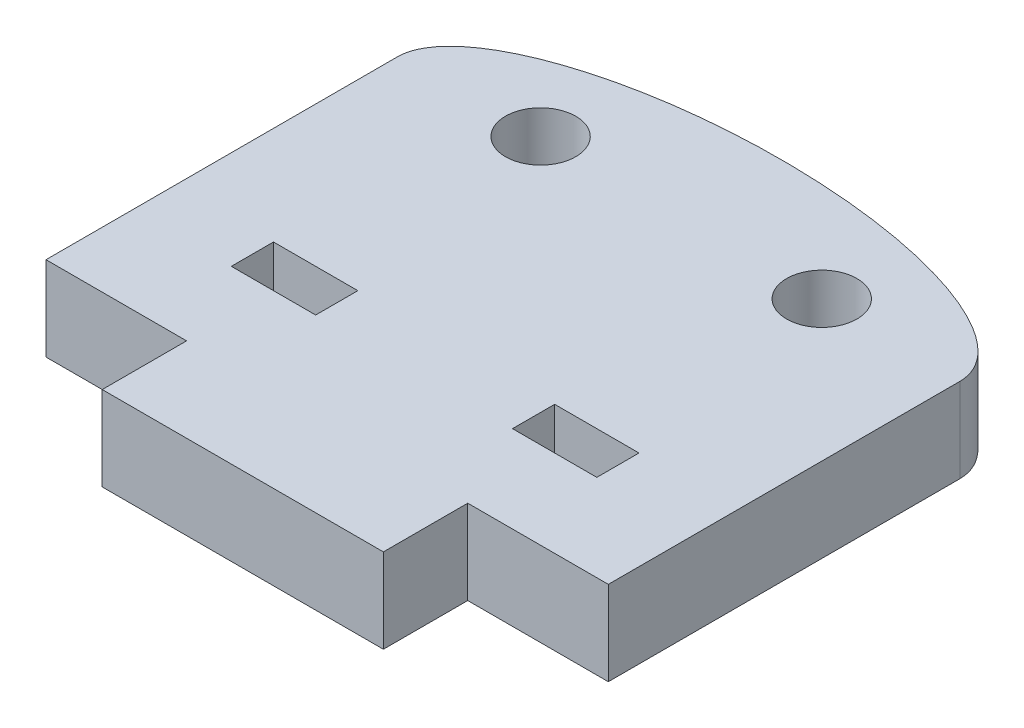
ISO-10303-21;
HEADER;
FILE_DESCRIPTION(('STEP AP214'),'2;1');
FILE_NAME('part.step','',(''),(''),'','','');
FILE_SCHEMA(('AUTOMOTIVE_DESIGN { 1 0 10303 214 1 1 1 1 }'));
ENDSEC;
DATA;
#1=APPLICATION_CONTEXT('core data for automotive mechanical design processes');
#2=APPLICATION_PROTOCOL_DEFINITION('international standard','automotive_design',2000,#1);
#3=PRODUCT_CONTEXT('',#1,'mechanical');
#4=PRODUCT('Part','Part','',(#3));
#5=PRODUCT_RELATED_PRODUCT_CATEGORY('part','',(#4));
#6=PRODUCT_DEFINITION_FORMATION('','',#4);
#7=PRODUCT_DEFINITION_CONTEXT('part definition',#1,'design');
#8=PRODUCT_DEFINITION('design','',#6,#7);
#9=PRODUCT_DEFINITION_SHAPE('','',#8);
#10=(LENGTH_UNIT() NAMED_UNIT(*) SI_UNIT(.MILLI.,.METRE.));
#11=(NAMED_UNIT(*) PLANE_ANGLE_UNIT() SI_UNIT($,.RADIAN.));
#12=(NAMED_UNIT(*) SI_UNIT($,.STERADIAN.) SOLID_ANGLE_UNIT());
#13=UNCERTAINTY_MEASURE_WITH_UNIT(LENGTH_MEASURE(1.E-05),#10,'distance_accuracy_value','');
#14=(GEOMETRIC_REPRESENTATION_CONTEXT(3) GLOBAL_UNCERTAINTY_ASSIGNED_CONTEXT((#13)) GLOBAL_UNIT_ASSIGNED_CONTEXT((#10,
#11,#12)) REPRESENTATION_CONTEXT('',''));
#15=CARTESIAN_POINT('',(0.,0.,0.));
#16=DIRECTION('',(0.,0.,1.));
#17=DIRECTION('',(1.,0.,0.));
#18=AXIS2_PLACEMENT_3D('',#15,#16,#17);
#19=CARTESIAN_POINT('',(-10.,6.,0.182836163524163));
#20=DIRECTION('',(0.,-1.,0.));
#21=DIRECTION('',(0.,0.,-1.));
#22=AXIS2_PLACEMENT_3D('',#19,#20,#21);
#23=PLANE('',#22);
#24=CARTESIAN_POINT('',(-20.,6.,0.));
#25=DIRECTION('',(0.,1.,0.));
#26=DIRECTION('',(0.,0.,1.));
#27=AXIS2_PLACEMENT_3D('',#24,#25,#26);
#28=CIRCLE('',#27,2.5);
#29=CARTESIAN_POINT('',(-20.,6.,2.5));
#30=VERTEX_POINT('',#29);
#31=EDGE_CURVE('E182',#30,#30,#28,.T.);
#32=ORIENTED_EDGE('',*,*,#31,.F.);
#33=EDGE_LOOP('',(#32));
#34=FACE_BOUND('',#33,.T.);
#35=DIRECTION('',(0.,0.,-1.));
#36=VECTOR('',#35,1.);
#37=CARTESIAN_POINT('',(3.00000000000001,6.,16.));
#38=LINE('',#37,#36);
#39=CARTESIAN_POINT('',(3.00000000000001,6.,19.));
#40=VERTEX_POINT('',#39);
#41=CARTESIAN_POINT('',(3.00000000000001,6.,16.));
#42=VERTEX_POINT('',#41);
#43=EDGE_CURVE('E188',#40,#42,#38,.T.);
#44=ORIENTED_EDGE('',*,*,#43,.F.);
#45=DIRECTION('',(1.,0.,0.));
#46=VECTOR('',#45,1.);
#47=CARTESIAN_POINT('',(-2.99999999999999,6.,19.));
#48=LINE('',#47,#46);
#49=CARTESIAN_POINT('',(-2.99999999999999,6.,19.));
#50=VERTEX_POINT('',#49);
#51=EDGE_CURVE('E196',#50,#40,#48,.T.);
#52=ORIENTED_EDGE('',*,*,#51,.F.);
#53=DIRECTION('',(0.,0.,1.));
#54=VECTOR('',#53,1.);
#55=CARTESIAN_POINT('',(-2.99999999999999,6.,16.));
#56=LINE('',#55,#54);
#57=CARTESIAN_POINT('',(-2.99999999999999,6.,16.));
#58=VERTEX_POINT('',#57);
#59=EDGE_CURVE('E193',#58,#50,#56,.T.);
#60=ORIENTED_EDGE('',*,*,#59,.F.);
#61=DIRECTION('',(-1.,0.,0.));
#62=VECTOR('',#61,1.);
#63=CARTESIAN_POINT('',(-2.99999999999999,6.,16.));
#64=LINE('',#63,#62);
#65=EDGE_CURVE('E190',#42,#58,#64,.T.);
#66=ORIENTED_EDGE('',*,*,#65,.F.);
#67=EDGE_LOOP('',(#44,#52,#60,#66));
#68=FACE_BOUND('',#67,.T.);
#69=DIRECTION('',(1.,0.,0.));
#70=VECTOR('',#69,1.);
#71=CARTESIAN_POINT('',(0.,6.,25.1828361635242));
#72=LINE('',#71,#70);
#73=CARTESIAN_POINT('',(0.,6.,25.1828361635242));
#74=VERTEX_POINT('',#73);
#75=CARTESIAN_POINT('',(9.99999999999999,6.,25.1828361635242));
#76=VERTEX_POINT('',#75);
#77=EDGE_CURVE('E225',#74,#76,#72,.T.);
#78=ORIENTED_EDGE('',*,*,#77,.T.);
#79=DIRECTION('',(0.,0.,-1.));
#80=VECTOR('',#79,1.);
#81=CARTESIAN_POINT('',(9.99999999999999,6.,0.182836163524163));
#82=LINE('',#81,#80);
#83=CARTESIAN_POINT('',(9.99999999999999,6.,0.182836163524163));
#84=VERTEX_POINT('',#83);
#85=EDGE_CURVE('E228',#76,#84,#82,.T.);
#86=ORIENTED_EDGE('',*,*,#85,.T.);
#87=CARTESIAN_POINT('',(-10.,6.,0.182836163524163));
#88=DIRECTION('',(0.,1.,0.));
#89=DIRECTION('',(1.,0.,0.));
#90=AXIS2_PLACEMENT_3D('',#87,#88,#89);
#91=ELLIPSE('',#90,20.,7.31715417643789);
#92=CARTESIAN_POINT('',(-30.,6.,0.182836163524163));
#93=VERTEX_POINT('',#92);
#94=EDGE_CURVE('E231',#84,#93,#91,.T.);
#95=ORIENTED_EDGE('',*,*,#94,.T.);
#96=DIRECTION('',(0.,0.,1.));
#97=VECTOR('',#96,1.);
#98=CARTESIAN_POINT('',(-30.,6.,0.182836163524163));
#99=LINE('',#98,#97);
#100=CARTESIAN_POINT('',(-30.,6.,25.1828361635242));
#101=VERTEX_POINT('',#100);
#102=EDGE_CURVE('E234',#93,#101,#99,.T.);
#103=ORIENTED_EDGE('',*,*,#102,.T.);
#104=DIRECTION('',(1.,0.,0.));
#105=VECTOR('',#104,1.);
#106=CARTESIAN_POINT('',(-30.,6.,25.1828361635242));
#107=LINE('',#106,#105);
#108=CARTESIAN_POINT('',(-20.,6.,25.1828361635242));
#109=VERTEX_POINT('',#108);
#110=EDGE_CURVE('E340',#101,#109,#107,.T.);
#111=ORIENTED_EDGE('',*,*,#110,.T.);
#112=DIRECTION('',(0.,0.,1.));
#113=VECTOR('',#112,1.);
#114=CARTESIAN_POINT('',(-20.,6.,25.1828361635242));
#115=LINE('',#114,#113);
#116=CARTESIAN_POINT('',(-20.,6.,31.1828361635242));
#117=VERTEX_POINT('',#116);
#118=EDGE_CURVE('E301',#109,#117,#115,.T.);
#119=ORIENTED_EDGE('',*,*,#118,.T.);
#120=DIRECTION('',(1.,0.,0.));
#121=VECTOR('',#120,1.);
#122=CARTESIAN_POINT('',(-20.,6.,31.1828361635242));
#123=LINE('',#122,#121);
#124=CARTESIAN_POINT('',(0.,6.,31.1828361635242));
#125=VERTEX_POINT('',#124);
#126=EDGE_CURVE('E338',#117,#125,#123,.T.);
#127=ORIENTED_EDGE('',*,*,#126,.T.);
#128=DIRECTION('',(0.,0.,-1.));
#129=VECTOR('',#128,1.);
#130=CARTESIAN_POINT('',(0.,6.,25.1828361635242));
#131=LINE('',#130,#129);
#132=EDGE_CURVE('E318',#125,#74,#131,.T.);
#133=ORIENTED_EDGE('',*,*,#132,.T.);
#134=EDGE_LOOP('',(#78,#86,#95,#103,#111,#119,#127,#133));
#135=FACE_BOUND('',#134,.T.);
#136=CARTESIAN_POINT('',(0.,6.,0.));
#137=DIRECTION('',(0.,1.,0.));
#138=DIRECTION('',(0.,0.,1.));
#139=AXIS2_PLACEMENT_3D('',#136,#137,#138);
#140=CIRCLE('',#139,2.5);
#141=CARTESIAN_POINT('',(0.,6.,2.5));
#142=VERTEX_POINT('',#141);
#143=EDGE_CURVE('E219',#142,#142,#140,.T.);
#144=ORIENTED_EDGE('',*,*,#143,.F.);
#145=EDGE_LOOP('',(#144));
#146=FACE_BOUND('',#145,.T.);
#147=DIRECTION('',(0.,0.,-1.));
#148=VECTOR('',#147,1.);
#149=CARTESIAN_POINT('',(-17.,6.,16.));
#150=LINE('',#149,#148);
#151=CARTESIAN_POINT('',(-17.,6.,19.));
#152=VERTEX_POINT('',#151);
#153=CARTESIAN_POINT('',(-17.,6.,16.));
#154=VERTEX_POINT('',#153);
#155=EDGE_CURVE('E146',#152,#154,#150,.T.);
#156=ORIENTED_EDGE('',*,*,#155,.F.);
#157=DIRECTION('',(1.,0.,0.));
#158=VECTOR('',#157,1.);
#159=CARTESIAN_POINT('',(-23.,6.,19.));
#160=LINE('',#159,#158);
#161=CARTESIAN_POINT('',(-23.,6.,19.));
#162=VERTEX_POINT('',#161);
#163=EDGE_CURVE('E168',#162,#152,#160,.T.);
#164=ORIENTED_EDGE('',*,*,#163,.F.);
#165=DIRECTION('',(0.,0.,1.));
#166=VECTOR('',#165,1.);
#167=CARTESIAN_POINT('',(-23.,6.,16.));
#168=LINE('',#167,#166);
#169=CARTESIAN_POINT('',(-23.,6.,16.));
#170=VERTEX_POINT('',#169);
#171=EDGE_CURVE('E166',#170,#162,#168,.T.);
#172=ORIENTED_EDGE('',*,*,#171,.F.);
#173=DIRECTION('',(-1.,0.,0.));
#174=VECTOR('',#173,1.);
#175=CARTESIAN_POINT('',(-23.,6.,16.));
#176=LINE('',#175,#174);
#177=EDGE_CURVE('E154',#154,#170,#176,.T.);
#178=ORIENTED_EDGE('',*,*,#177,.F.);
#179=EDGE_LOOP('',(#156,#164,#172,#178));
#180=FACE_BOUND('',#179,.T.);
#181=ADVANCED_FACE('F33',(#34,#68,#135,#146,#180),#23,.F.);
#182=CARTESIAN_POINT('',(-10.,0.,0.182836163524163));
#183=DIRECTION('',(0.,-1.,0.));
#184=DIRECTION('',(0.,0.,-1.));
#185=AXIS2_PLACEMENT_3D('',#182,#183,#184);
#186=PLANE('',#185);
#187=DIRECTION('',(1.,0.,0.));
#188=VECTOR('',#187,1.);
#189=CARTESIAN_POINT('',(-2.99999999999999,0.,19.));
#190=LINE('',#189,#188);
#191=CARTESIAN_POINT('',(-2.99999999999999,0.,19.));
#192=VERTEX_POINT('',#191);
#193=CARTESIAN_POINT('',(3.00000000000001,0.,19.));
#194=VERTEX_POINT('',#193);
#195=EDGE_CURVE('E191',#192,#194,#190,.T.);
#196=ORIENTED_EDGE('',*,*,#195,.T.);
#197=DIRECTION('',(0.,0.,-1.));
#198=VECTOR('',#197,1.);
#199=CARTESIAN_POINT('',(3.00000000000001,0.,16.));
#200=LINE('',#199,#198);
#201=CARTESIAN_POINT('',(3.00000000000001,0.,16.));
#202=VERTEX_POINT('',#201);
#203=EDGE_CURVE('E185',#194,#202,#200,.T.);
#204=ORIENTED_EDGE('',*,*,#203,.T.);
#205=DIRECTION('',(-1.,0.,0.));
#206=VECTOR('',#205,1.);
#207=CARTESIAN_POINT('',(-2.99999999999999,0.,16.));
#208=LINE('',#207,#206);
#209=CARTESIAN_POINT('',(-2.99999999999999,0.,16.));
#210=VERTEX_POINT('',#209);
#211=EDGE_CURVE('E201',#202,#210,#208,.T.);
#212=ORIENTED_EDGE('',*,*,#211,.T.);
#213=DIRECTION('',(0.,0.,1.));
#214=VECTOR('',#213,1.);
#215=CARTESIAN_POINT('',(-2.99999999999999,0.,16.));
#216=LINE('',#215,#214);
#217=EDGE_CURVE('E204',#210,#192,#216,.T.);
#218=ORIENTED_EDGE('',*,*,#217,.T.);
#219=EDGE_LOOP('',(#196,#204,#212,#218));
#220=FACE_BOUND('',#219,.T.);
#221=CARTESIAN_POINT('',(0.,0.,0.));
#222=DIRECTION('',(0.,1.,0.));
#223=DIRECTION('',(0.,0.,1.));
#224=AXIS2_PLACEMENT_3D('',#221,#222,#223);
#225=CIRCLE('',#224,2.5);
#226=CARTESIAN_POINT('',(0.,0.,2.5));
#227=VERTEX_POINT('',#226);
#228=EDGE_CURVE('E218',#227,#227,#225,.T.);
#229=ORIENTED_EDGE('',*,*,#228,.T.);
#230=EDGE_LOOP('',(#229));
#231=FACE_BOUND('',#230,.T.);
#232=DIRECTION('',(1.,0.,0.));
#233=VECTOR('',#232,1.);
#234=CARTESIAN_POINT('',(0.,0.,25.1828361635242));
#235=LINE('',#234,#233);
#236=CARTESIAN_POINT('',(0.,0.,25.1828361635242));
#237=VERTEX_POINT('',#236);
#238=CARTESIAN_POINT('',(9.99999999999999,0.,25.1828361635242));
#239=VERTEX_POINT('',#238);
#240=EDGE_CURVE('E222',#237,#239,#235,.T.);
#241=ORIENTED_EDGE('',*,*,#240,.F.);
#242=DIRECTION('',(0.,0.,-1.));
#243=VECTOR('',#242,1.);
#244=CARTESIAN_POINT('',(0.,0.,25.1828361635242));
#245=LINE('',#244,#243);
#246=CARTESIAN_POINT('',(0.,0.,31.1828361635242));
#247=VERTEX_POINT('',#246);
#248=EDGE_CURVE('E229',#247,#237,#245,.T.);
#249=ORIENTED_EDGE('',*,*,#248,.F.);
#250=DIRECTION('',(1.,0.,0.));
#251=VECTOR('',#250,1.);
#252=CARTESIAN_POINT('',(-20.,0.,31.1828361635242));
#253=LINE('',#252,#251);
#254=CARTESIAN_POINT('',(-20.,0.,31.1828361635242));
#255=VERTEX_POINT('',#254);
#256=EDGE_CURVE('E308',#255,#247,#253,.T.);
#257=ORIENTED_EDGE('',*,*,#256,.F.);
#258=DIRECTION('',(0.,0.,1.));
#259=VECTOR('',#258,1.);
#260=CARTESIAN_POINT('',(-20.,0.,25.1828361635242));
#261=LINE('',#260,#259);
#262=CARTESIAN_POINT('',(-20.,0.,25.1828361635242));
#263=VERTEX_POINT('',#262);
#264=EDGE_CURVE('E296',#263,#255,#261,.T.);
#265=ORIENTED_EDGE('',*,*,#264,.F.);
#266=DIRECTION('',(1.,0.,0.));
#267=VECTOR('',#266,1.);
#268=CARTESIAN_POINT('',(-30.,0.,25.1828361635242));
#269=LINE('',#268,#267);
#270=CARTESIAN_POINT('',(-30.,0.,25.1828361635242));
#271=VERTEX_POINT('',#270);
#272=EDGE_CURVE('E286',#271,#263,#269,.T.);
#273=ORIENTED_EDGE('',*,*,#272,.F.);
#274=DIRECTION('',(0.,0.,1.));
#275=VECTOR('',#274,1.);
#276=CARTESIAN_POINT('',(-30.,0.,0.182836163524163));
#277=LINE('',#276,#275);
#278=CARTESIAN_POINT('',(-30.,0.,0.182836163524163));
#279=VERTEX_POINT('',#278);
#280=EDGE_CURVE('E297',#279,#271,#277,.T.);
#281=ORIENTED_EDGE('',*,*,#280,.F.);
#282=CARTESIAN_POINT('',(-10.,0.,0.182836163524163));
#283=DIRECTION('',(0.,1.,0.));
#284=DIRECTION('',(1.,0.,0.));
#285=AXIS2_PLACEMENT_3D('',#282,#283,#284);
#286=ELLIPSE('',#285,20.,7.31715417643789);
#287=CARTESIAN_POINT('',(9.99999999999999,0.,0.182836163524163));
#288=VERTEX_POINT('',#287);
#289=EDGE_CURVE('E330',#288,#279,#286,.T.);
#290=ORIENTED_EDGE('',*,*,#289,.F.);
#291=DIRECTION('',(0.,0.,-1.));
#292=VECTOR('',#291,1.);
#293=CARTESIAN_POINT('',(9.99999999999999,0.,0.182836163524163));
#294=LINE('',#293,#292);
#295=EDGE_CURVE('E331',#239,#288,#294,.T.);
#296=ORIENTED_EDGE('',*,*,#295,.F.);
#297=EDGE_LOOP('',(#241,#249,#257,#265,#273,#281,#290,#296));
#298=FACE_BOUND('',#297,.T.);
#299=CARTESIAN_POINT('',(-20.,0.,0.));
#300=DIRECTION('',(0.,1.,0.));
#301=DIRECTION('',(0.,0.,1.));
#302=AXIS2_PLACEMENT_3D('',#299,#300,#301);
#303=CIRCLE('',#302,2.5);
#304=CARTESIAN_POINT('',(-20.,0.,2.5));
#305=VERTEX_POINT('',#304);
#306=EDGE_CURVE('E162',#305,#305,#303,.T.);
#307=ORIENTED_EDGE('',*,*,#306,.T.);
#308=EDGE_LOOP('',(#307));
#309=FACE_BOUND('',#308,.T.);
#310=DIRECTION('',(1.,0.,0.));
#311=VECTOR('',#310,1.);
#312=CARTESIAN_POINT('',(-23.,0.,19.));
#313=LINE('',#312,#311);
#314=CARTESIAN_POINT('',(-23.,0.,19.));
#315=VERTEX_POINT('',#314);
#316=CARTESIAN_POINT('',(-17.,0.,19.));
#317=VERTEX_POINT('',#316);
#318=EDGE_CURVE('E155',#315,#317,#313,.T.);
#319=ORIENTED_EDGE('',*,*,#318,.T.);
#320=DIRECTION('',(0.,0.,-1.));
#321=VECTOR('',#320,1.);
#322=CARTESIAN_POINT('',(-17.,0.,16.));
#323=LINE('',#322,#321);
#324=CARTESIAN_POINT('',(-17.,0.,16.));
#325=VERTEX_POINT('',#324);
#326=EDGE_CURVE('E56',#317,#325,#323,.T.);
#327=ORIENTED_EDGE('',*,*,#326,.T.);
#328=DIRECTION('',(-1.,0.,0.));
#329=VECTOR('',#328,1.);
#330=CARTESIAN_POINT('',(-23.,0.,16.));
#331=LINE('',#330,#329);
#332=CARTESIAN_POINT('',(-23.,0.,16.));
#333=VERTEX_POINT('',#332);
#334=EDGE_CURVE('E161',#325,#333,#331,.T.);
#335=ORIENTED_EDGE('',*,*,#334,.T.);
#336=DIRECTION('',(0.,0.,1.));
#337=VECTOR('',#336,1.);
#338=CARTESIAN_POINT('',(-23.,0.,16.));
#339=LINE('',#338,#337);
#340=EDGE_CURVE('E174',#333,#315,#339,.T.);
#341=ORIENTED_EDGE('',*,*,#340,.T.);
#342=EDGE_LOOP('',(#319,#327,#335,#341));
#343=FACE_BOUND('',#342,.T.);
#344=ADVANCED_FACE('F249',(#220,#231,#298,#309,#343),#186,.T.);
#345=CARTESIAN_POINT('',(0.,6.,25.1828361635242));
#346=DIRECTION('',(0.,0.,-1.));
#347=DIRECTION('',(-1.,0.,0.));
#348=AXIS2_PLACEMENT_3D('',#345,#346,#347);
#349=PLANE('',#348);
#350=ORIENTED_EDGE('',*,*,#240,.T.);
#351=DIRECTION('',(0.,-1.,0.));
#352=VECTOR('',#351,1.);
#353=CARTESIAN_POINT('',(9.99999999999999,6.,25.1828361635242));
#354=LINE('',#353,#352);
#355=EDGE_CURVE('E11',#76,#239,#354,.T.);
#356=ORIENTED_EDGE('',*,*,#355,.F.);
#357=ORIENTED_EDGE('',*,*,#77,.F.);
#358=DIRECTION('',(0.,-1.,0.));
#359=VECTOR('',#358,1.);
#360=CARTESIAN_POINT('',(0.,6.,25.1828361635242));
#361=LINE('',#360,#359);
#362=EDGE_CURVE('E314',#74,#237,#361,.T.);
#363=ORIENTED_EDGE('',*,*,#362,.T.);
#364=EDGE_LOOP('',(#350,#356,#357,#363));
#365=FACE_BOUND('',#364,.T.);
#366=ADVANCED_FACE('F35',(#365),#349,.F.);
#367=CARTESIAN_POINT('',(9.99999999999999,6.,0.182836163524163));
#368=DIRECTION('',(-1.,0.,0.));
#369=DIRECTION('',(0.,0.,1.));
#370=AXIS2_PLACEMENT_3D('',#367,#368,#369);
#371=PLANE('',#370);
#372=ORIENTED_EDGE('',*,*,#295,.T.);
#373=DIRECTION('',(0.,-1.,0.));
#374=VECTOR('',#373,1.);
#375=CARTESIAN_POINT('',(9.99999999999999,6.,0.182836163524163));
#376=LINE('',#375,#374);
#377=EDGE_CURVE('E41',#84,#288,#376,.T.);
#378=ORIENTED_EDGE('',*,*,#377,.F.);
#379=ORIENTED_EDGE('',*,*,#85,.F.);
#380=ORIENTED_EDGE('',*,*,#355,.T.);
#381=EDGE_LOOP('',(#372,#378,#379,#380));
#382=FACE_BOUND('',#381,.T.);
#383=ADVANCED_FACE('F241',(#382),#371,.F.);
#384=DIRECTION('',(0.,-1.,0.));
#385=VECTOR('',#384,1.);
#386=SURFACE_OF_LINEAR_EXTRUSION('',#91,#385);
#387=ORIENTED_EDGE('',*,*,#289,.T.);
#388=DIRECTION('',(0.,-1.,0.));
#389=VECTOR('',#388,1.);
#390=CARTESIAN_POINT('',(-30.,6.,0.182836163524163));
#391=LINE('',#390,#389);
#392=EDGE_CURVE('E323',#93,#279,#391,.T.);
#393=ORIENTED_EDGE('',*,*,#392,.F.);
#394=ORIENTED_EDGE('',*,*,#94,.F.);
#395=ORIENTED_EDGE('',*,*,#377,.T.);
#396=EDGE_LOOP('',(#387,#393,#394,#395));
#397=FACE_BOUND('',#396,.T.);
#398=ADVANCED_FACE('F237',(#397),#386,.F.);
#399=CARTESIAN_POINT('',(-30.,6.,0.182836163524163));
#400=DIRECTION('',(1.,0.,0.));
#401=DIRECTION('',(0.,0.,-1.));
#402=AXIS2_PLACEMENT_3D('',#399,#400,#401);
#403=PLANE('',#402);
#404=ORIENTED_EDGE('',*,*,#280,.T.);
#405=DIRECTION('',(0.,-1.,0.));
#406=VECTOR('',#405,1.);
#407=CARTESIAN_POINT('',(-30.,6.,25.1828361635242));
#408=LINE('',#407,#406);
#409=EDGE_CURVE('E292',#101,#271,#408,.T.);
#410=ORIENTED_EDGE('',*,*,#409,.F.);
#411=ORIENTED_EDGE('',*,*,#102,.F.);
#412=ORIENTED_EDGE('',*,*,#392,.T.);
#413=EDGE_LOOP('',(#404,#410,#411,#412));
#414=FACE_BOUND('',#413,.T.);
#415=ADVANCED_FACE('F240',(#414),#403,.F.);
#416=CARTESIAN_POINT('',(-30.,6.,25.1828361635242));
#417=DIRECTION('',(0.,0.,-1.));
#418=DIRECTION('',(-1.,0.,0.));
#419=AXIS2_PLACEMENT_3D('',#416,#417,#418);
#420=PLANE('',#419);
#421=ORIENTED_EDGE('',*,*,#272,.T.);
#422=DIRECTION('',(0.,-1.,0.));
#423=VECTOR('',#422,1.);
#424=CARTESIAN_POINT('',(-20.,6.,25.1828361635242));
#425=LINE('',#424,#423);
#426=EDGE_CURVE('E289',#109,#263,#425,.T.);
#427=ORIENTED_EDGE('',*,*,#426,.F.);
#428=ORIENTED_EDGE('',*,*,#110,.F.);
#429=ORIENTED_EDGE('',*,*,#409,.T.);
#430=EDGE_LOOP('',(#421,#427,#428,#429));
#431=FACE_BOUND('',#430,.T.);
#432=ADVANCED_FACE('F275',(#431),#420,.F.);
#433=CARTESIAN_POINT('',(-20.,6.,25.1828361635242));
#434=DIRECTION('',(1.,0.,0.));
#435=DIRECTION('',(0.,0.,-1.));
#436=AXIS2_PLACEMENT_3D('',#433,#434,#435);
#437=PLANE('',#436);
#438=ORIENTED_EDGE('',*,*,#264,.T.);
#439=DIRECTION('',(0.,-1.,0.));
#440=VECTOR('',#439,1.);
#441=CARTESIAN_POINT('',(-20.,6.,31.1828361635242));
#442=LINE('',#441,#440);
#443=EDGE_CURVE('E302',#117,#255,#442,.T.);
#444=ORIENTED_EDGE('',*,*,#443,.F.);
#445=ORIENTED_EDGE('',*,*,#118,.F.);
#446=ORIENTED_EDGE('',*,*,#426,.T.);
#447=EDGE_LOOP('',(#438,#444,#445,#446));
#448=FACE_BOUND('',#447,.T.);
#449=ADVANCED_FACE('F272',(#448),#437,.F.);
#450=CARTESIAN_POINT('',(-20.,6.,31.1828361635242));
#451=DIRECTION('',(0.,0.,-1.));
#452=DIRECTION('',(-1.,0.,0.));
#453=AXIS2_PLACEMENT_3D('',#450,#451,#452);
#454=PLANE('',#453);
#455=ORIENTED_EDGE('',*,*,#256,.T.);
#456=DIRECTION('',(0.,-1.,0.));
#457=VECTOR('',#456,1.);
#458=CARTESIAN_POINT('',(0.,6.,31.1828361635242));
#459=LINE('',#458,#457);
#460=EDGE_CURVE('E317',#125,#247,#459,.T.);
#461=ORIENTED_EDGE('',*,*,#460,.F.);
#462=ORIENTED_EDGE('',*,*,#126,.F.);
#463=ORIENTED_EDGE('',*,*,#443,.T.);
#464=EDGE_LOOP('',(#455,#461,#462,#463));
#465=FACE_BOUND('',#464,.T.);
#466=ADVANCED_FACE('F268',(#465),#454,.F.);
#467=CARTESIAN_POINT('',(0.,6.,25.1828361635242));
#468=DIRECTION('',(-1.,0.,0.));
#469=DIRECTION('',(0.,0.,1.));
#470=AXIS2_PLACEMENT_3D('',#467,#468,#469);
#471=PLANE('',#470);
#472=ORIENTED_EDGE('',*,*,#248,.T.);
#473=ORIENTED_EDGE('',*,*,#362,.F.);
#474=ORIENTED_EDGE('',*,*,#132,.F.);
#475=ORIENTED_EDGE('',*,*,#460,.T.);
#476=EDGE_LOOP('',(#472,#473,#474,#475));
#477=FACE_BOUND('',#476,.T.);
#478=ADVANCED_FACE('F265',(#477),#471,.F.);
#479=CARTESIAN_POINT('',(0.,6.,0.));
#480=DIRECTION('',(0.,-1.,0.));
#481=DIRECTION('',(0.,0.,-1.));
#482=AXIS2_PLACEMENT_3D('',#479,#480,#481);
#483=CYLINDRICAL_SURFACE('',#482,2.5);
#484=ORIENTED_EDGE('',*,*,#143,.T.);
#485=EDGE_LOOP('',(#484));
#486=FACE_BOUND('',#485,.T.);
#487=ORIENTED_EDGE('',*,*,#228,.F.);
#488=EDGE_LOOP('',(#487));
#489=FACE_BOUND('',#488,.T.);
#490=ADVANCED_FACE('F262',(#486,#489),#483,.F.);
#491=CARTESIAN_POINT('',(3.00000000000001,6.,16.));
#492=DIRECTION('',(-1.,0.,0.));
#493=DIRECTION('',(0.,0.,1.));
#494=AXIS2_PLACEMENT_3D('',#491,#492,#493);
#495=PLANE('',#494);
#496=ORIENTED_EDGE('',*,*,#203,.F.);
#497=DIRECTION('',(0.,-1.,0.));
#498=VECTOR('',#497,1.);
#499=CARTESIAN_POINT('',(3.00000000000001,6.,19.));
#500=LINE('',#499,#498);
#501=EDGE_CURVE('E198',#40,#194,#500,.T.);
#502=ORIENTED_EDGE('',*,*,#501,.F.);
#503=ORIENTED_EDGE('',*,*,#43,.T.);
#504=DIRECTION('',(0.,-1.,0.));
#505=VECTOR('',#504,1.);
#506=CARTESIAN_POINT('',(3.00000000000001,6.,16.));
#507=LINE('',#506,#505);
#508=EDGE_CURVE('E215',#42,#202,#507,.T.);
#509=ORIENTED_EDGE('',*,*,#508,.T.);
#510=EDGE_LOOP('',(#496,#502,#503,#509));
#511=FACE_BOUND('',#510,.T.);
#512=ADVANCED_FACE('F354',(#511),#495,.T.);
#513=CARTESIAN_POINT('',(-2.99999999999999,6.,16.));
#514=DIRECTION('',(0.,0.,1.));
#515=DIRECTION('',(1.,0.,0.));
#516=AXIS2_PLACEMENT_3D('',#513,#514,#515);
#517=PLANE('',#516);
#518=ORIENTED_EDGE('',*,*,#211,.F.);
#519=ORIENTED_EDGE('',*,*,#508,.F.);
#520=ORIENTED_EDGE('',*,*,#65,.T.);
#521=DIRECTION('',(0.,-1.,0.));
#522=VECTOR('',#521,1.);
#523=CARTESIAN_POINT('',(-2.99999999999999,6.,16.));
#524=LINE('',#523,#522);
#525=EDGE_CURVE('E213',#58,#210,#524,.T.);
#526=ORIENTED_EDGE('',*,*,#525,.T.);
#527=EDGE_LOOP('',(#518,#519,#520,#526));
#528=FACE_BOUND('',#527,.T.);
#529=ADVANCED_FACE('F360',(#528),#517,.T.);
#530=CARTESIAN_POINT('',(-2.99999999999999,6.,16.));
#531=DIRECTION('',(1.,0.,0.));
#532=DIRECTION('',(0.,0.,-1.));
#533=AXIS2_PLACEMENT_3D('',#530,#531,#532);
#534=PLANE('',#533);
#535=ORIENTED_EDGE('',*,*,#217,.F.);
#536=ORIENTED_EDGE('',*,*,#525,.F.);
#537=ORIENTED_EDGE('',*,*,#59,.T.);
#538=DIRECTION('',(0.,-1.,0.));
#539=VECTOR('',#538,1.);
#540=CARTESIAN_POINT('',(-2.99999999999999,6.,19.));
#541=LINE('',#540,#539);
#542=EDGE_CURVE('E211',#50,#192,#541,.T.);
#543=ORIENTED_EDGE('',*,*,#542,.T.);
#544=EDGE_LOOP('',(#535,#536,#537,#543));
#545=FACE_BOUND('',#544,.T.);
#546=ADVANCED_FACE('F365',(#545),#534,.T.);
#547=CARTESIAN_POINT('',(-2.99999999999999,6.,19.));
#548=DIRECTION('',(0.,0.,-1.));
#549=DIRECTION('',(-1.,0.,0.));
#550=AXIS2_PLACEMENT_3D('',#547,#548,#549);
#551=PLANE('',#550);
#552=ORIENTED_EDGE('',*,*,#195,.F.);
#553=ORIENTED_EDGE('',*,*,#542,.F.);
#554=ORIENTED_EDGE('',*,*,#51,.T.);
#555=ORIENTED_EDGE('',*,*,#501,.T.);
#556=EDGE_LOOP('',(#552,#553,#554,#555));
#557=FACE_BOUND('',#556,.T.);
#558=ADVANCED_FACE('F371',(#557),#551,.T.);
#559=CARTESIAN_POINT('',(-20.,6.,0.));
#560=DIRECTION('',(0.,-1.,0.));
#561=DIRECTION('',(0.,0.,-1.));
#562=AXIS2_PLACEMENT_3D('',#559,#560,#561);
#563=CYLINDRICAL_SURFACE('',#562,2.5);
#564=ORIENTED_EDGE('',*,*,#31,.T.);
#565=EDGE_LOOP('',(#564));
#566=FACE_BOUND('',#565,.T.);
#567=ORIENTED_EDGE('',*,*,#306,.F.);
#568=EDGE_LOOP('',(#567));
#569=FACE_BOUND('',#568,.T.);
#570=ADVANCED_FACE('F375',(#566,#569),#563,.F.);
#571=CARTESIAN_POINT('',(-17.,6.,16.));
#572=DIRECTION('',(-1.,0.,0.));
#573=DIRECTION('',(0.,0.,1.));
#574=AXIS2_PLACEMENT_3D('',#571,#572,#573);
#575=PLANE('',#574);
#576=ORIENTED_EDGE('',*,*,#326,.F.);
#577=DIRECTION('',(0.,-1.,0.));
#578=VECTOR('',#577,1.);
#579=CARTESIAN_POINT('',(-17.,6.,19.));
#580=LINE('',#579,#578);
#581=EDGE_CURVE('E150',#152,#317,#580,.T.);
#582=ORIENTED_EDGE('',*,*,#581,.F.);
#583=ORIENTED_EDGE('',*,*,#155,.T.);
#584=DIRECTION('',(0.,-1.,0.));
#585=VECTOR('',#584,1.);
#586=CARTESIAN_POINT('',(-17.,6.,16.));
#587=LINE('',#586,#585);
#588=EDGE_CURVE('E149',#154,#325,#587,.T.);
#589=ORIENTED_EDGE('',*,*,#588,.T.);
#590=EDGE_LOOP('',(#576,#582,#583,#589));
#591=FACE_BOUND('',#590,.T.);
#592=ADVANCED_FACE('F148',(#591),#575,.T.);
#593=CARTESIAN_POINT('',(-23.,6.,16.));
#594=DIRECTION('',(0.,0.,1.));
#595=DIRECTION('',(1.,0.,0.));
#596=AXIS2_PLACEMENT_3D('',#593,#594,#595);
#597=PLANE('',#596);
#598=ORIENTED_EDGE('',*,*,#334,.F.);
#599=ORIENTED_EDGE('',*,*,#588,.F.);
#600=ORIENTED_EDGE('',*,*,#177,.T.);
#601=DIRECTION('',(0.,-1.,0.));
#602=VECTOR('',#601,1.);
#603=CARTESIAN_POINT('',(-23.,6.,16.));
#604=LINE('',#603,#602);
#605=EDGE_CURVE('E163',#170,#333,#604,.T.);
#606=ORIENTED_EDGE('',*,*,#605,.T.);
#607=EDGE_LOOP('',(#598,#599,#600,#606));
#608=FACE_BOUND('',#607,.T.);
#609=ADVANCED_FACE('F158',(#608),#597,.T.);
#610=CARTESIAN_POINT('',(-23.,6.,16.));
#611=DIRECTION('',(1.,0.,0.));
#612=DIRECTION('',(0.,0.,-1.));
#613=AXIS2_PLACEMENT_3D('',#610,#611,#612);
#614=PLANE('',#613);
#615=ORIENTED_EDGE('',*,*,#340,.F.);
#616=ORIENTED_EDGE('',*,*,#605,.F.);
#617=ORIENTED_EDGE('',*,*,#171,.T.);
#618=DIRECTION('',(0.,-1.,0.));
#619=VECTOR('',#618,1.);
#620=CARTESIAN_POINT('',(-23.,6.,19.));
#621=LINE('',#620,#619);
#622=EDGE_CURVE('E48',#162,#315,#621,.T.);
#623=ORIENTED_EDGE('',*,*,#622,.T.);
#624=EDGE_LOOP('',(#615,#616,#617,#623));
#625=FACE_BOUND('',#624,.T.);
#626=ADVANCED_FACE('F384',(#625),#614,.T.);
#627=CARTESIAN_POINT('',(-23.,6.,19.));
#628=DIRECTION('',(0.,0.,-1.));
#629=DIRECTION('',(-1.,0.,0.));
#630=AXIS2_PLACEMENT_3D('',#627,#628,#629);
#631=PLANE('',#630);
#632=ORIENTED_EDGE('',*,*,#318,.F.);
#633=ORIENTED_EDGE('',*,*,#622,.F.);
#634=ORIENTED_EDGE('',*,*,#163,.T.);
#635=ORIENTED_EDGE('',*,*,#581,.T.);
#636=EDGE_LOOP('',(#632,#633,#634,#635));
#637=FACE_BOUND('',#636,.T.);
#638=ADVANCED_FACE('F387',(#637),#631,.T.);
#639=CLOSED_SHELL('',(#181,#344,#366,#383,#398,#415,#432,#449,#466,#478,#490,#512,#529,#546,
#558,#570,#592,#609,#626,#638));
#640=MANIFOLD_SOLID_BREP('B2',#639);
#641=ADVANCED_BREP_SHAPE_REPRESENTATION('',(#18,#640),#14);
#642=SHAPE_DEFINITION_REPRESENTATION(#9,#641);
ENDSEC;
END-ISO-10303-21;
